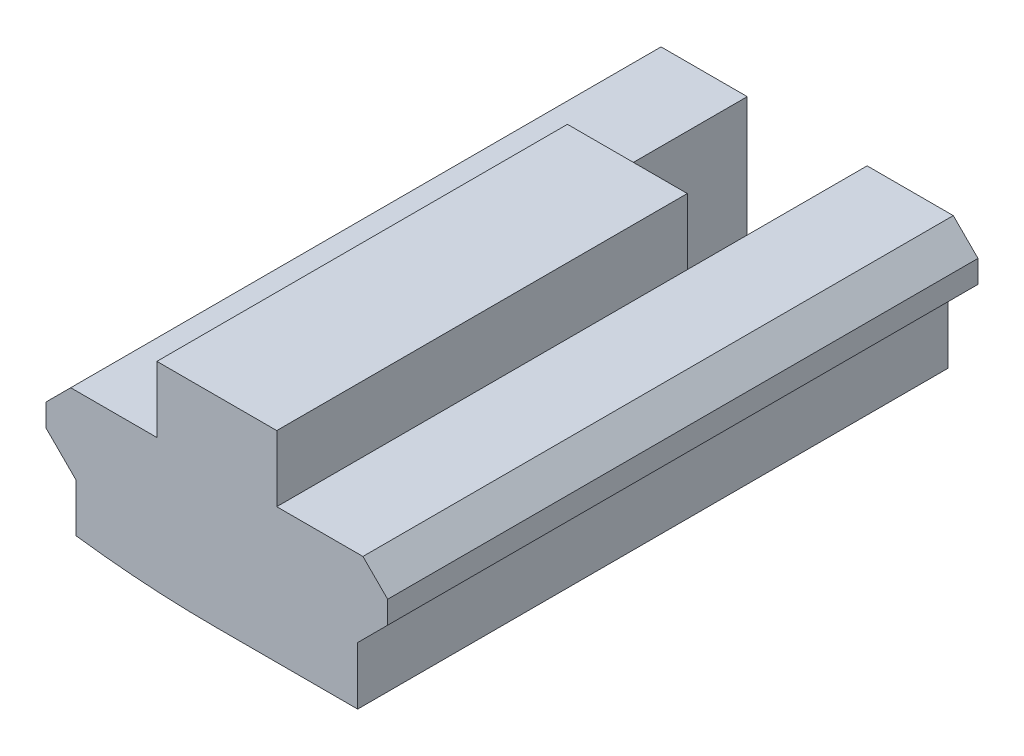
ISO-10303-21;
HEADER;
FILE_DESCRIPTION(('STEP AP214'),'2;1');
FILE_NAME('part.step','',(''),(''),'','','');
FILE_SCHEMA(('AUTOMOTIVE_DESIGN { 1 0 10303 214 1 1 1 1 }'));
ENDSEC;
DATA;
#1=APPLICATION_CONTEXT('core data for automotive mechanical design processes');
#2=APPLICATION_PROTOCOL_DEFINITION('international standard','automotive_design',2000,#1);
#3=PRODUCT_CONTEXT('',#1,'mechanical');
#4=PRODUCT('Part','Part','',(#3));
#5=PRODUCT_RELATED_PRODUCT_CATEGORY('part','',(#4));
#6=PRODUCT_DEFINITION_FORMATION('','',#4);
#7=PRODUCT_DEFINITION_CONTEXT('part definition',#1,'design');
#8=PRODUCT_DEFINITION('design','',#6,#7);
#9=PRODUCT_DEFINITION_SHAPE('','',#8);
#10=(LENGTH_UNIT() NAMED_UNIT(*) SI_UNIT(.MILLI.,.METRE.));
#11=(NAMED_UNIT(*) PLANE_ANGLE_UNIT() SI_UNIT($,.RADIAN.));
#12=(NAMED_UNIT(*) SI_UNIT($,.STERADIAN.) SOLID_ANGLE_UNIT());
#13=UNCERTAINTY_MEASURE_WITH_UNIT(LENGTH_MEASURE(1.E-05),#10,'distance_accuracy_value','');
#14=(GEOMETRIC_REPRESENTATION_CONTEXT(3) GLOBAL_UNCERTAINTY_ASSIGNED_CONTEXT((#13)) GLOBAL_UNIT_ASSIGNED_CONTEXT((#10,
#11,#12)) REPRESENTATION_CONTEXT('',''));
#15=CARTESIAN_POINT('',(0.,0.,0.));
#16=DIRECTION('',(0.,0.,1.));
#17=DIRECTION('',(1.,0.,0.));
#18=AXIS2_PLACEMENT_3D('',#15,#16,#17);
#19=CARTESIAN_POINT('',(-120.,35.6272021191581,-19.7));
#20=DIRECTION('',(0.,0.,-1.));
#21=DIRECTION('',(-1.,0.,0.));
#22=AXIS2_PLACEMENT_3D('',#19,#20,#21);
#23=PLANE('',#22);
#24=DIRECTION('',(0.,1.,0.));
#25=VECTOR('',#24,1.);
#26=CARTESIAN_POINT('',(-122.,35.6272021191581,-19.7));
#27=LINE('',#26,#25);
#28=CARTESIAN_POINT('',(-122.,0.0561811773950802,-19.7));
#29=VERTEX_POINT('',#28);
#30=CARTESIAN_POINT('',(-122.,4.50000000000001,-19.7));
#31=VERTEX_POINT('',#30);
#32=EDGE_CURVE('E11',#29,#31,#27,.T.);
#33=ORIENTED_EDGE('',*,*,#32,.F.);
#34=CARTESIAN_POINT('',(-120.,35.6272021191581,-19.7));
#35=DIRECTION('',(0.,0.,1.));
#36=DIRECTION('',(-1.,0.,0.));
#37=AXIS2_PLACEMENT_3D('',#34,#35,#36);
#38=CIRCLE('',#37,35.6272021191581);
#39=CARTESIAN_POINT('',(-124.7,0.311376617842921,-19.7));
#40=VERTEX_POINT('',#39);
#41=EDGE_CURVE('E213',#40,#29,#38,.T.);
#42=ORIENTED_EDGE('',*,*,#41,.F.);
#43=DIRECTION('',(0.,-1.,0.));
#44=VECTOR('',#43,1.);
#45=CARTESIAN_POINT('',(-124.7,1.92426406871194,-19.7));
#46=LINE('',#45,#44);
#47=CARTESIAN_POINT('',(-124.7,1.92426406871194,-19.7));
#48=VERTEX_POINT('',#47);
#49=EDGE_CURVE('E159',#48,#40,#46,.T.);
#50=ORIENTED_EDGE('',*,*,#49,.F.);
#51=DIRECTION('',(0.707106781186548,-0.707106781186547,0.));
#52=VECTOR('',#51,1.);
#53=CARTESIAN_POINT('',(-125.7,2.92426406871194,-19.7));
#54=LINE('',#53,#52);
#55=CARTESIAN_POINT('',(-125.7,2.92426406871194,-19.7));
#56=VERTEX_POINT('',#55);
#57=EDGE_CURVE('E144',#56,#48,#54,.T.);
#58=ORIENTED_EDGE('',*,*,#57,.F.);
#59=DIRECTION('',(0.,-1.,0.));
#60=VECTOR('',#59,1.);
#61=CARTESIAN_POINT('',(-125.7,3.67573593128807,-19.7));
#62=LINE('',#61,#60);
#63=CARTESIAN_POINT('',(-125.7,3.67573593128807,-19.7));
#64=VERTEX_POINT('',#63);
#65=EDGE_CURVE('E157',#64,#56,#62,.T.);
#66=ORIENTED_EDGE('',*,*,#65,.F.);
#67=DIRECTION('',(-0.70710678118655,-0.707106781186545,0.));
#68=VECTOR('',#67,1.);
#69=CARTESIAN_POINT('',(-124.875735931288,4.50000000000001,-19.7));
#70=LINE('',#69,#68);
#71=CARTESIAN_POINT('',(-124.875735931288,4.50000000000001,-19.7));
#72=VERTEX_POINT('',#71);
#73=EDGE_CURVE('E162',#72,#64,#70,.T.);
#74=ORIENTED_EDGE('',*,*,#73,.F.);
#75=DIRECTION('',(-1.,0.,0.));
#76=VECTOR('',#75,1.);
#77=CARTESIAN_POINT('',(-122.,4.50000000000001,-19.7));
#78=LINE('',#77,#76);
#79=EDGE_CURVE('E164',#31,#72,#78,.T.);
#80=ORIENTED_EDGE('',*,*,#79,.F.);
#81=EDGE_LOOP('',(#33,#42,#50,#58,#66,#74,#80));
#82=FACE_BOUND('',#81,.T.);
#83=ADVANCED_FACE('F37',(#82),#23,.T.);
#84=CARTESIAN_POINT('',(-120.,35.6272021191581,-19.7));
#85=DIRECTION('',(0.,0.,1.));
#86=DIRECTION('',(1.,0.,0.));
#87=AXIS2_PLACEMENT_3D('',#84,#85,#86);
#88=CYLINDRICAL_SURFACE('',#87,35.6272021191581);
#89=DIRECTION('',(0.,0.,1.));
#90=VECTOR('',#89,1.);
#91=CARTESIAN_POINT('',(-122.,0.0561811773950802,-19.7));
#92=LINE('',#91,#90);
#93=CARTESIAN_POINT('',(-122.,0.0561811773950802,-13.7));
#94=VERTEX_POINT('',#93);
#95=EDGE_CURVE('E286',#94,#29,#92,.F.);
#96=ORIENTED_EDGE('',*,*,#95,.F.);
#97=CARTESIAN_POINT('',(-120.,35.6272021191581,-13.7));
#98=DIRECTION('',(0.,0.,1.));
#99=DIRECTION('',(1.,0.,0.));
#100=AXIS2_PLACEMENT_3D('',#97,#98,#99);
#101=CIRCLE('',#100,35.6272021191581);
#102=CARTESIAN_POINT('',(-120.,0.,-13.7));
#103=VERTEX_POINT('',#102);
#104=EDGE_CURVE('E174',#103,#94,#101,.F.);
#105=ORIENTED_EDGE('',*,*,#104,.F.);
#106=DIRECTION('',(0.,0.,1.));
#107=VECTOR('',#106,1.);
#108=CARTESIAN_POINT('',(-120.,0.,-19.7));
#109=LINE('',#108,#107);
#110=CARTESIAN_POINT('',(-120.,0.,0.));
#111=VERTEX_POINT('',#110);
#112=EDGE_CURVE('E169',#103,#111,#109,.T.);
#113=ORIENTED_EDGE('',*,*,#112,.T.);
#114=CARTESIAN_POINT('',(-120.,35.6272021191581,0.));
#115=DIRECTION('',(0.,0.,1.));
#116=DIRECTION('',(-1.,0.,0.));
#117=AXIS2_PLACEMENT_3D('',#114,#115,#116);
#118=CIRCLE('',#117,35.6272021191581);
#119=CARTESIAN_POINT('',(-124.7,0.311376617842921,0.));
#120=VERTEX_POINT('',#119);
#121=EDGE_CURVE('E170',#120,#111,#118,.T.);
#122=ORIENTED_EDGE('',*,*,#121,.F.);
#123=DIRECTION('',(0.,0.,1.));
#124=VECTOR('',#123,1.);
#125=CARTESIAN_POINT('',(-124.7,0.311376617842921,-19.7));
#126=LINE('',#125,#124);
#127=EDGE_CURVE('E46',#40,#120,#126,.T.);
#128=ORIENTED_EDGE('',*,*,#127,.F.);
#129=ORIENTED_EDGE('',*,*,#41,.T.);
#130=EDGE_LOOP('',(#96,#105,#113,#122,#128,#129));
#131=FACE_BOUND('',#130,.T.);
#132=ADVANCED_FACE('F39',(#131),#88,.T.);
#133=CARTESIAN_POINT('',(-124.7,1.92426406871194,-19.7));
#134=DIRECTION('',(-1.,0.,0.));
#135=DIRECTION('',(0.,-1.,0.));
#136=AXIS2_PLACEMENT_3D('',#133,#134,#135);
#137=PLANE('',#136);
#138=DIRECTION('',(0.,-1.,0.));
#139=VECTOR('',#138,1.);
#140=CARTESIAN_POINT('',(-124.7,1.92426406871194,0.));
#141=LINE('',#140,#139);
#142=CARTESIAN_POINT('',(-124.7,1.92426406871194,0.));
#143=VERTEX_POINT('',#142);
#144=EDGE_CURVE('E210',#143,#120,#141,.T.);
#145=ORIENTED_EDGE('',*,*,#144,.F.);
#146=DIRECTION('',(0.,0.,1.));
#147=VECTOR('',#146,1.);
#148=CARTESIAN_POINT('',(-124.7,1.92426406871194,-19.7));
#149=LINE('',#148,#147);
#150=EDGE_CURVE('E104',#48,#143,#149,.T.);
#151=ORIENTED_EDGE('',*,*,#150,.F.);
#152=ORIENTED_EDGE('',*,*,#49,.T.);
#153=ORIENTED_EDGE('',*,*,#127,.T.);
#154=EDGE_LOOP('',(#145,#151,#152,#153));
#155=FACE_BOUND('',#154,.T.);
#156=ADVANCED_FACE('F251',(#155),#137,.T.);
#157=CARTESIAN_POINT('',(-125.7,2.92426406871194,-19.7));
#158=DIRECTION('',(-0.707106781186547,-0.707106781186548,0.));
#159=DIRECTION('',(0.707106781186548,-0.707106781186547,0.));
#160=AXIS2_PLACEMENT_3D('',#157,#158,#159);
#161=PLANE('',#160);
#162=DIRECTION('',(0.707106781186548,-0.707106781186547,0.));
#163=VECTOR('',#162,1.);
#164=CARTESIAN_POINT('',(-125.7,2.92426406871194,0.));
#165=LINE('',#164,#163);
#166=CARTESIAN_POINT('',(-125.7,2.92426406871194,0.));
#167=VERTEX_POINT('',#166);
#168=EDGE_CURVE('E146',#167,#143,#165,.T.);
#169=ORIENTED_EDGE('',*,*,#168,.F.);
#170=DIRECTION('',(0.,0.,1.));
#171=VECTOR('',#170,1.);
#172=CARTESIAN_POINT('',(-125.7,2.92426406871194,-19.7));
#173=LINE('',#172,#171);
#174=EDGE_CURVE('E141',#56,#167,#173,.T.);
#175=ORIENTED_EDGE('',*,*,#174,.F.);
#176=ORIENTED_EDGE('',*,*,#57,.T.);
#177=ORIENTED_EDGE('',*,*,#150,.T.);
#178=EDGE_LOOP('',(#169,#175,#176,#177));
#179=FACE_BOUND('',#178,.T.);
#180=ADVANCED_FACE('F143',(#179),#161,.T.);
#181=CARTESIAN_POINT('',(-125.7,3.67573593128807,-19.7));
#182=DIRECTION('',(-1.,0.,0.));
#183=DIRECTION('',(0.,0.,1.));
#184=AXIS2_PLACEMENT_3D('',#181,#182,#183);
#185=PLANE('',#184);
#186=DIRECTION('',(0.,-1.,0.));
#187=VECTOR('',#186,1.);
#188=CARTESIAN_POINT('',(-125.7,3.67573593128807,0.));
#189=LINE('',#188,#187);
#190=CARTESIAN_POINT('',(-125.7,3.67573593128807,0.));
#191=VERTEX_POINT('',#190);
#192=EDGE_CURVE('E207',#191,#167,#189,.T.);
#193=ORIENTED_EDGE('',*,*,#192,.F.);
#194=DIRECTION('',(0.,0.,1.));
#195=VECTOR('',#194,1.);
#196=CARTESIAN_POINT('',(-125.7,3.67573593128807,-19.7));
#197=LINE('',#196,#195);
#198=EDGE_CURVE('E151',#64,#191,#197,.T.);
#199=ORIENTED_EDGE('',*,*,#198,.F.);
#200=ORIENTED_EDGE('',*,*,#65,.T.);
#201=ORIENTED_EDGE('',*,*,#174,.T.);
#202=EDGE_LOOP('',(#193,#199,#200,#201));
#203=FACE_BOUND('',#202,.T.);
#204=ADVANCED_FACE('F161',(#203),#185,.T.);
#205=CARTESIAN_POINT('',(-124.875735931288,4.50000000000001,-19.7));
#206=DIRECTION('',(-0.707106781186545,0.70710678118655,0.));
#207=DIRECTION('',(-0.70710678118655,-0.707106781186545,0.));
#208=AXIS2_PLACEMENT_3D('',#205,#206,#207);
#209=PLANE('',#208);
#210=DIRECTION('',(-0.70710678118655,-0.707106781186545,0.));
#211=VECTOR('',#210,1.);
#212=CARTESIAN_POINT('',(-124.875735931288,4.50000000000001,0.));
#213=LINE('',#212,#211);
#214=CARTESIAN_POINT('',(-124.875735931288,4.50000000000001,0.));
#215=VERTEX_POINT('',#214);
#216=EDGE_CURVE('E204',#215,#191,#213,.T.);
#217=ORIENTED_EDGE('',*,*,#216,.F.);
#218=DIRECTION('',(0.,0.,1.));
#219=VECTOR('',#218,1.);
#220=CARTESIAN_POINT('',(-124.875735931288,4.50000000000001,-19.7));
#221=LINE('',#220,#219);
#222=EDGE_CURVE('E217',#72,#215,#221,.T.);
#223=ORIENTED_EDGE('',*,*,#222,.F.);
#224=ORIENTED_EDGE('',*,*,#73,.T.);
#225=ORIENTED_EDGE('',*,*,#198,.T.);
#226=EDGE_LOOP('',(#217,#223,#224,#225));
#227=FACE_BOUND('',#226,.T.);
#228=ADVANCED_FACE('F355',(#227),#209,.T.);
#229=CARTESIAN_POINT('',(-122.,4.50000000000001,-19.7));
#230=DIRECTION('',(0.,1.,0.));
#231=DIRECTION('',(-1.,0.,0.));
#232=AXIS2_PLACEMENT_3D('',#229,#230,#231);
#233=PLANE('',#232);
#234=DIRECTION('',(-1.,0.,0.));
#235=VECTOR('',#234,1.);
#236=CARTESIAN_POINT('',(-122.,4.50000000000001,0.));
#237=LINE('',#236,#235);
#238=CARTESIAN_POINT('',(-122.,4.50000000000001,0.));
#239=VERTEX_POINT('',#238);
#240=EDGE_CURVE('E201',#239,#215,#237,.T.);
#241=ORIENTED_EDGE('',*,*,#240,.F.);
#242=DIRECTION('',(0.,0.,1.));
#243=VECTOR('',#242,1.);
#244=CARTESIAN_POINT('',(-122.,4.50000000000001,-19.7));
#245=LINE('',#244,#243);
#246=CARTESIAN_POINT('',(-122.,4.50000000000001,-13.7));
#247=VERTEX_POINT('',#246);
#248=EDGE_CURVE('E222',#247,#239,#245,.T.);
#249=ORIENTED_EDGE('',*,*,#248,.F.);
#250=EDGE_CURVE('E219',#31,#247,#245,.T.);
#251=ORIENTED_EDGE('',*,*,#250,.F.);
#252=ORIENTED_EDGE('',*,*,#79,.T.);
#253=ORIENTED_EDGE('',*,*,#222,.T.);
#254=EDGE_LOOP('',(#241,#249,#251,#252,#253));
#255=FACE_BOUND('',#254,.T.);
#256=ADVANCED_FACE('F352',(#255),#233,.T.);
#257=CARTESIAN_POINT('',(-122.,6.70000000000001,-19.7));
#258=DIRECTION('',(-1.,0.,0.));
#259=DIRECTION('',(0.,-1.,0.));
#260=AXIS2_PLACEMENT_3D('',#257,#258,#259);
#261=PLANE('',#260);
#262=DIRECTION('',(0.,1.,0.));
#263=VECTOR('',#262,1.);
#264=CARTESIAN_POINT('',(-122.,0.,-13.7));
#265=LINE('',#264,#263);
#266=CARTESIAN_POINT('',(-122.,6.70000000000001,-13.7));
#267=VERTEX_POINT('',#266);
#268=EDGE_CURVE('E315',#247,#267,#265,.T.);
#269=ORIENTED_EDGE('',*,*,#268,.F.);
#270=ORIENTED_EDGE('',*,*,#248,.T.);
#271=DIRECTION('',(0.,-1.,0.));
#272=VECTOR('',#271,1.);
#273=CARTESIAN_POINT('',(-122.,6.70000000000001,0.));
#274=LINE('',#273,#272);
#275=CARTESIAN_POINT('',(-122.,6.70000000000001,0.));
#276=VERTEX_POINT('',#275);
#277=EDGE_CURVE('E198',#276,#239,#274,.T.);
#278=ORIENTED_EDGE('',*,*,#277,.F.);
#279=DIRECTION('',(0.,0.,1.));
#280=VECTOR('',#279,1.);
#281=CARTESIAN_POINT('',(-122.,6.70000000000001,-19.7));
#282=LINE('',#281,#280);
#283=EDGE_CURVE('E223',#267,#276,#282,.T.);
#284=ORIENTED_EDGE('',*,*,#283,.F.);
#285=EDGE_LOOP('',(#269,#270,#278,#284));
#286=FACE_BOUND('',#285,.T.);
#287=ADVANCED_FACE('F361',(#286),#261,.T.);
#288=CARTESIAN_POINT('',(-118.,6.70000000000001,-19.7));
#289=DIRECTION('',(0.,1.,0.));
#290=DIRECTION('',(-1.,0.,0.));
#291=AXIS2_PLACEMENT_3D('',#288,#289,#290);
#292=PLANE('',#291);
#293=DIRECTION('',(1.,0.,0.));
#294=VECTOR('',#293,1.);
#295=CARTESIAN_POINT('',(-118.,6.70000000000001,-13.7));
#296=LINE('',#295,#294);
#297=CARTESIAN_POINT('',(-118.,6.70000000000001,-13.7));
#298=VERTEX_POINT('',#297);
#299=EDGE_CURVE('E310',#267,#298,#296,.T.);
#300=ORIENTED_EDGE('',*,*,#299,.F.);
#301=ORIENTED_EDGE('',*,*,#283,.T.);
#302=DIRECTION('',(-1.,0.,0.));
#303=VECTOR('',#302,1.);
#304=CARTESIAN_POINT('',(-118.,6.70000000000001,0.));
#305=LINE('',#304,#303);
#306=CARTESIAN_POINT('',(-118.,6.70000000000001,0.));
#307=VERTEX_POINT('',#306);
#308=EDGE_CURVE('E195',#307,#276,#305,.T.);
#309=ORIENTED_EDGE('',*,*,#308,.F.);
#310=DIRECTION('',(0.,0.,1.));
#311=VECTOR('',#310,1.);
#312=CARTESIAN_POINT('',(-118.,6.70000000000001,-19.7));
#313=LINE('',#312,#311);
#314=EDGE_CURVE('E225',#298,#307,#313,.T.);
#315=ORIENTED_EDGE('',*,*,#314,.F.);
#316=EDGE_LOOP('',(#300,#301,#309,#315));
#317=FACE_BOUND('',#316,.T.);
#318=ADVANCED_FACE('F366',(#317),#292,.T.);
#319=CARTESIAN_POINT('',(-118.,4.50000000000001,-19.7));
#320=DIRECTION('',(1.,0.,0.));
#321=DIRECTION('',(0.,1.,0.));
#322=AXIS2_PLACEMENT_3D('',#319,#320,#321);
#323=PLANE('',#322);
#324=DIRECTION('',(0.,1.,0.));
#325=VECTOR('',#324,1.);
#326=CARTESIAN_POINT('',(-118.,0.,-13.7));
#327=LINE('',#326,#325);
#328=CARTESIAN_POINT('',(-118.,4.50000000000001,-13.7));
#329=VERTEX_POINT('',#328);
#330=EDGE_CURVE('E321',#329,#298,#327,.T.);
#331=ORIENTED_EDGE('',*,*,#330,.T.);
#332=ORIENTED_EDGE('',*,*,#314,.T.);
#333=DIRECTION('',(0.,1.,0.));
#334=VECTOR('',#333,1.);
#335=CARTESIAN_POINT('',(-118.,4.50000000000001,0.));
#336=LINE('',#335,#334);
#337=CARTESIAN_POINT('',(-118.,4.50000000000001,0.));
#338=VERTEX_POINT('',#337);
#339=EDGE_CURVE('E192',#338,#307,#336,.T.);
#340=ORIENTED_EDGE('',*,*,#339,.F.);
#341=DIRECTION('',(0.,0.,1.));
#342=VECTOR('',#341,1.);
#343=CARTESIAN_POINT('',(-118.,4.50000000000001,-19.7));
#344=LINE('',#343,#342);
#345=EDGE_CURVE('E230',#329,#338,#344,.T.);
#346=ORIENTED_EDGE('',*,*,#345,.F.);
#347=EDGE_LOOP('',(#331,#332,#340,#346));
#348=FACE_BOUND('',#347,.T.);
#349=ADVANCED_FACE('F369',(#348),#323,.T.);
#350=CARTESIAN_POINT('',(-115.124264068712,4.50000000000001,-19.7));
#351=DIRECTION('',(0.,1.,0.));
#352=DIRECTION('',(-1.,0.,0.));
#353=AXIS2_PLACEMENT_3D('',#350,#351,#352);
#354=PLANE('',#353);
#355=DIRECTION('',(-1.,0.,0.));
#356=VECTOR('',#355,1.);
#357=CARTESIAN_POINT('',(-115.124264068712,4.50000000000001,0.));
#358=LINE('',#357,#356);
#359=CARTESIAN_POINT('',(-115.124264068712,4.50000000000001,0.));
#360=VERTEX_POINT('',#359);
#361=EDGE_CURVE('E189',#360,#338,#358,.T.);
#362=ORIENTED_EDGE('',*,*,#361,.F.);
#363=DIRECTION('',(0.,0.,1.));
#364=VECTOR('',#363,1.);
#365=CARTESIAN_POINT('',(-115.124264068712,4.50000000000001,-19.7));
#366=LINE('',#365,#364);
#367=CARTESIAN_POINT('',(-115.124264068712,4.50000000000001,-19.7));
#368=VERTEX_POINT('',#367);
#369=EDGE_CURVE('E231',#368,#360,#366,.T.);
#370=ORIENTED_EDGE('',*,*,#369,.F.);
#371=DIRECTION('',(-1.,0.,0.));
#372=VECTOR('',#371,1.);
#373=CARTESIAN_POINT('',(-115.124264068712,4.50000000000001,-19.7));
#374=LINE('',#373,#372);
#375=CARTESIAN_POINT('',(-118.,4.50000000000001,-19.7));
#376=VERTEX_POINT('',#375);
#377=EDGE_CURVE('E280',#368,#376,#374,.T.);
#378=ORIENTED_EDGE('',*,*,#377,.T.);
#379=EDGE_CURVE('E227',#376,#329,#344,.T.);
#380=ORIENTED_EDGE('',*,*,#379,.T.);
#381=ORIENTED_EDGE('',*,*,#345,.T.);
#382=EDGE_LOOP('',(#362,#370,#378,#380,#381));
#383=FACE_BOUND('',#382,.T.);
#384=ADVANCED_FACE('F291',(#383),#354,.T.);
#385=CARTESIAN_POINT('',(-114.3,3.67573593128808,-19.7));
#386=DIRECTION('',(0.707106781186537,0.707106781186558,0.));
#387=DIRECTION('',(-0.707106781186558,0.707106781186537,0.));
#388=AXIS2_PLACEMENT_3D('',#385,#386,#387);
#389=PLANE('',#388);
#390=DIRECTION('',(-0.707106781186558,0.707106781186537,0.));
#391=VECTOR('',#390,1.);
#392=CARTESIAN_POINT('',(-114.3,3.67573593128808,0.));
#393=LINE('',#392,#391);
#394=CARTESIAN_POINT('',(-114.3,3.67573593128808,0.));
#395=VERTEX_POINT('',#394);
#396=EDGE_CURVE('E186',#395,#360,#393,.T.);
#397=ORIENTED_EDGE('',*,*,#396,.F.);
#398=DIRECTION('',(0.,0.,1.));
#399=VECTOR('',#398,1.);
#400=CARTESIAN_POINT('',(-114.3,3.67573593128808,-19.7));
#401=LINE('',#400,#399);
#402=CARTESIAN_POINT('',(-114.3,3.67573593128808,-19.7));
#403=VERTEX_POINT('',#402);
#404=EDGE_CURVE('E233',#403,#395,#401,.T.);
#405=ORIENTED_EDGE('',*,*,#404,.F.);
#406=DIRECTION('',(-0.707106781186558,0.707106781186537,0.));
#407=VECTOR('',#406,1.);
#408=CARTESIAN_POINT('',(-114.3,3.67573593128808,-19.7));
#409=LINE('',#408,#407);
#410=EDGE_CURVE('E293',#403,#368,#409,.T.);
#411=ORIENTED_EDGE('',*,*,#410,.T.);
#412=ORIENTED_EDGE('',*,*,#369,.T.);
#413=EDGE_LOOP('',(#397,#405,#411,#412));
#414=FACE_BOUND('',#413,.T.);
#415=ADVANCED_FACE('F452',(#414),#389,.T.);
#416=CARTESIAN_POINT('',(-114.3,2.92426406871195,-19.7));
#417=DIRECTION('',(1.,0.,0.));
#418=DIRECTION('',(0.,1.,0.));
#419=AXIS2_PLACEMENT_3D('',#416,#417,#418);
#420=PLANE('',#419);
#421=DIRECTION('',(0.,1.,0.));
#422=VECTOR('',#421,1.);
#423=CARTESIAN_POINT('',(-114.3,2.92426406871195,0.));
#424=LINE('',#423,#422);
#425=CARTESIAN_POINT('',(-114.3,2.92426406871195,0.));
#426=VERTEX_POINT('',#425);
#427=EDGE_CURVE('E183',#426,#395,#424,.T.);
#428=ORIENTED_EDGE('',*,*,#427,.F.);
#429=DIRECTION('',(0.,0.,1.));
#430=VECTOR('',#429,1.);
#431=CARTESIAN_POINT('',(-114.3,2.92426406871195,-19.7));
#432=LINE('',#431,#430);
#433=CARTESIAN_POINT('',(-114.3,2.92426406871195,-19.7));
#434=VERTEX_POINT('',#433);
#435=EDGE_CURVE('E235',#434,#426,#432,.T.);
#436=ORIENTED_EDGE('',*,*,#435,.F.);
#437=DIRECTION('',(0.,1.,0.));
#438=VECTOR('',#437,1.);
#439=CARTESIAN_POINT('',(-114.3,2.92426406871195,-19.7));
#440=LINE('',#439,#438);
#441=EDGE_CURVE('E296',#434,#403,#440,.T.);
#442=ORIENTED_EDGE('',*,*,#441,.T.);
#443=ORIENTED_EDGE('',*,*,#404,.T.);
#444=EDGE_LOOP('',(#428,#436,#442,#443));
#445=FACE_BOUND('',#444,.T.);
#446=ADVANCED_FACE('F485',(#445),#420,.T.);
#447=CARTESIAN_POINT('',(-115.3,1.92426406871193,-19.7));
#448=DIRECTION('',(0.707106781186553,-0.707106781186542,0.));
#449=DIRECTION('',(0.707106781186542,0.707106781186553,0.));
#450=AXIS2_PLACEMENT_3D('',#447,#448,#449);
#451=PLANE('',#450);
#452=DIRECTION('',(0.707106781186542,0.707106781186553,0.));
#453=VECTOR('',#452,1.);
#454=CARTESIAN_POINT('',(-115.3,1.92426406871193,0.));
#455=LINE('',#454,#453);
#456=CARTESIAN_POINT('',(-115.3,1.92426406871193,0.));
#457=VERTEX_POINT('',#456);
#458=EDGE_CURVE('E180',#457,#426,#455,.T.);
#459=ORIENTED_EDGE('',*,*,#458,.F.);
#460=DIRECTION('',(0.,0.,1.));
#461=VECTOR('',#460,1.);
#462=CARTESIAN_POINT('',(-115.3,1.92426406871193,-19.7));
#463=LINE('',#462,#461);
#464=CARTESIAN_POINT('',(-115.3,1.92426406871193,-19.7));
#465=VERTEX_POINT('',#464);
#466=EDGE_CURVE('E237',#465,#457,#463,.T.);
#467=ORIENTED_EDGE('',*,*,#466,.F.);
#468=DIRECTION('',(0.707106781186542,0.707106781186553,0.));
#469=VECTOR('',#468,1.);
#470=CARTESIAN_POINT('',(-115.3,1.92426406871193,-19.7));
#471=LINE('',#470,#469);
#472=EDGE_CURVE('E301',#465,#434,#471,.T.);
#473=ORIENTED_EDGE('',*,*,#472,.T.);
#474=ORIENTED_EDGE('',*,*,#435,.T.);
#475=EDGE_LOOP('',(#459,#467,#473,#474));
#476=FACE_BOUND('',#475,.T.);
#477=ADVANCED_FACE('F476',(#476),#451,.T.);
#478=CARTESIAN_POINT('',(-115.3,0.,-19.7));
#479=DIRECTION('',(1.,0.,0.));
#480=DIRECTION('',(0.,1.,0.));
#481=AXIS2_PLACEMENT_3D('',#478,#479,#480);
#482=PLANE('',#481);
#483=DIRECTION('',(0.,1.,0.));
#484=VECTOR('',#483,1.);
#485=CARTESIAN_POINT('',(-115.3,0.,0.));
#486=LINE('',#485,#484);
#487=CARTESIAN_POINT('',(-115.3,0.,0.));
#488=VERTEX_POINT('',#487);
#489=EDGE_CURVE('E177',#488,#457,#486,.T.);
#490=ORIENTED_EDGE('',*,*,#489,.F.);
#491=DIRECTION('',(0.,0.,1.));
#492=VECTOR('',#491,1.);
#493=CARTESIAN_POINT('',(-115.3,0.,-19.7));
#494=LINE('',#493,#492);
#495=CARTESIAN_POINT('',(-115.3,0.,-19.7));
#496=VERTEX_POINT('',#495);
#497=EDGE_CURVE('E239',#496,#488,#494,.T.);
#498=ORIENTED_EDGE('',*,*,#497,.F.);
#499=DIRECTION('',(0.,1.,0.));
#500=VECTOR('',#499,1.);
#501=CARTESIAN_POINT('',(-115.3,0.,-19.7));
#502=LINE('',#501,#500);
#503=EDGE_CURVE('E304',#496,#465,#502,.T.);
#504=ORIENTED_EDGE('',*,*,#503,.T.);
#505=ORIENTED_EDGE('',*,*,#466,.T.);
#506=EDGE_LOOP('',(#490,#498,#504,#505));
#507=FACE_BOUND('',#506,.T.);
#508=ADVANCED_FACE('F273',(#507),#482,.T.);
#509=CARTESIAN_POINT('',(-115.3,0.,-19.7));
#510=DIRECTION('',(0.,-1.,0.));
#511=DIRECTION('',(1.,0.,0.));
#512=AXIS2_PLACEMENT_3D('',#509,#510,#511);
#513=PLANE('',#512);
#514=DIRECTION('',(0.,0.,-1.));
#515=VECTOR('',#514,1.);
#516=CARTESIAN_POINT('',(-118.,0.,-19.7));
#517=LINE('',#516,#515);
#518=CARTESIAN_POINT('',(-118.,0.,-13.7));
#519=VERTEX_POINT('',#518);
#520=CARTESIAN_POINT('',(-118.,0.,-19.7));
#521=VERTEX_POINT('',#520);
#522=EDGE_CURVE('E319',#519,#521,#517,.T.);
#523=ORIENTED_EDGE('',*,*,#522,.T.);
#524=DIRECTION('',(1.,0.,0.));
#525=VECTOR('',#524,1.);
#526=CARTESIAN_POINT('',(-115.3,0.,-19.7));
#527=LINE('',#526,#525);
#528=EDGE_CURVE('E116',#521,#496,#527,.T.);
#529=ORIENTED_EDGE('',*,*,#528,.T.);
#530=ORIENTED_EDGE('',*,*,#497,.T.);
#531=DIRECTION('',(1.,0.,0.));
#532=VECTOR('',#531,1.);
#533=CARTESIAN_POINT('',(-115.3,0.,0.));
#534=LINE('',#533,#532);
#535=EDGE_CURVE('E173',#111,#488,#534,.T.);
#536=ORIENTED_EDGE('',*,*,#535,.F.);
#537=ORIENTED_EDGE('',*,*,#112,.F.);
#538=DIRECTION('',(1.,0.,0.));
#539=VECTOR('',#538,1.);
#540=CARTESIAN_POINT('',(-122.,0.,-13.7));
#541=LINE('',#540,#539);
#542=EDGE_CURVE('E324',#103,#519,#541,.T.);
#543=ORIENTED_EDGE('',*,*,#542,.T.);
#544=EDGE_LOOP('',(#523,#529,#530,#536,#537,#543));
#545=FACE_BOUND('',#544,.T.);
#546=ADVANCED_FACE('F247',(#545),#513,.T.);
#547=DIRECTION('',(0.,1.,0.));
#548=VECTOR('',#547,1.);
#549=CARTESIAN_POINT('',(-118.,0.,-19.7));
#550=LINE('',#549,#548);
#551=EDGE_CURVE('E277',#521,#376,#550,.T.);
#552=ORIENTED_EDGE('',*,*,#551,.T.);
#553=ORIENTED_EDGE('',*,*,#377,.F.);
#554=ORIENTED_EDGE('',*,*,#410,.F.);
#555=ORIENTED_EDGE('',*,*,#441,.F.);
#556=ORIENTED_EDGE('',*,*,#472,.F.);
#557=ORIENTED_EDGE('',*,*,#503,.F.);
#558=ORIENTED_EDGE('',*,*,#528,.F.);
#559=EDGE_LOOP('',(#552,#553,#554,#555,#556,#557,#558));
#560=FACE_BOUND('',#559,.T.);
#561=ADVANCED_FACE('F262',(#560),#23,.T.);
#562=CARTESIAN_POINT('',(-120.,35.6272021191581,0.));
#563=DIRECTION('',(0.,0.,-1.));
#564=DIRECTION('',(-1.,0.,0.));
#565=AXIS2_PLACEMENT_3D('',#562,#563,#564);
#566=PLANE('',#565);
#567=ORIENTED_EDGE('',*,*,#121,.T.);
#568=ORIENTED_EDGE('',*,*,#535,.T.);
#569=ORIENTED_EDGE('',*,*,#489,.T.);
#570=ORIENTED_EDGE('',*,*,#458,.T.);
#571=ORIENTED_EDGE('',*,*,#427,.T.);
#572=ORIENTED_EDGE('',*,*,#396,.T.);
#573=ORIENTED_EDGE('',*,*,#361,.T.);
#574=ORIENTED_EDGE('',*,*,#339,.T.);
#575=ORIENTED_EDGE('',*,*,#308,.T.);
#576=ORIENTED_EDGE('',*,*,#277,.T.);
#577=ORIENTED_EDGE('',*,*,#240,.T.);
#578=ORIENTED_EDGE('',*,*,#216,.T.);
#579=ORIENTED_EDGE('',*,*,#192,.T.);
#580=ORIENTED_EDGE('',*,*,#168,.T.);
#581=ORIENTED_EDGE('',*,*,#144,.T.);
#582=EDGE_LOOP('',(#567,#568,#569,#570,#571,#572,#573,#574,#575,#576,#577,#578,#579,#580,#581));
#583=FACE_BOUND('',#582,.T.);
#584=ADVANCED_FACE('F250',(#583),#566,.F.);
#585=CARTESIAN_POINT('',(-122.,0.,-19.7));
#586=DIRECTION('',(-1.,0.,0.));
#587=DIRECTION('',(0.,-1.,0.));
#588=AXIS2_PLACEMENT_3D('',#585,#586,#587);
#589=PLANE('',#588);
#590=ORIENTED_EDGE('',*,*,#95,.T.);
#591=ORIENTED_EDGE('',*,*,#32,.T.);
#592=ORIENTED_EDGE('',*,*,#250,.T.);
#593=EDGE_CURVE('E318',#94,#247,#265,.T.);
#594=ORIENTED_EDGE('',*,*,#593,.F.);
#595=EDGE_LOOP('',(#590,#591,#592,#594));
#596=FACE_BOUND('',#595,.T.);
#597=ADVANCED_FACE('F272',(#596),#589,.F.);
#598=CARTESIAN_POINT('',(-118.,0.,-19.7));
#599=DIRECTION('',(1.,0.,0.));
#600=DIRECTION('',(0.,1.,0.));
#601=AXIS2_PLACEMENT_3D('',#598,#599,#600);
#602=PLANE('',#601);
#603=ORIENTED_EDGE('',*,*,#379,.F.);
#604=ORIENTED_EDGE('',*,*,#551,.F.);
#605=ORIENTED_EDGE('',*,*,#522,.F.);
#606=EDGE_CURVE('E287',#519,#329,#327,.T.);
#607=ORIENTED_EDGE('',*,*,#606,.T.);
#608=EDGE_LOOP('',(#603,#604,#605,#607));
#609=FACE_BOUND('',#608,.T.);
#610=ADVANCED_FACE('F371',(#609),#602,.F.);
#611=CARTESIAN_POINT('',(-122.,0.,-13.7));
#612=DIRECTION('',(0.,0.,1.));
#613=DIRECTION('',(1.,0.,0.));
#614=AXIS2_PLACEMENT_3D('',#611,#612,#613);
#615=PLANE('',#614);
#616=ORIENTED_EDGE('',*,*,#104,.T.);
#617=ORIENTED_EDGE('',*,*,#593,.T.);
#618=ORIENTED_EDGE('',*,*,#268,.T.);
#619=ORIENTED_EDGE('',*,*,#299,.T.);
#620=ORIENTED_EDGE('',*,*,#330,.F.);
#621=ORIENTED_EDGE('',*,*,#606,.F.);
#622=ORIENTED_EDGE('',*,*,#542,.F.);
#623=EDGE_LOOP('',(#616,#617,#618,#619,#620,#621,#622));
#624=FACE_BOUND('',#623,.T.);
#625=ADVANCED_FACE('F330',(#624),#615,.F.);
#626=CLOSED_SHELL('',(#83,#132,#156,#180,#204,#228,#256,#287,#318,#349,#384,#415,#446,#477,#508,
#546,#561,#584,#597,#610,#625));
#627=MANIFOLD_SOLID_BREP('B2',#626);
#628=ADVANCED_BREP_SHAPE_REPRESENTATION('',(#18,#627),#14);
#629=SHAPE_DEFINITION_REPRESENTATION(#9,#628);
ENDSEC;
END-ISO-10303-21;
